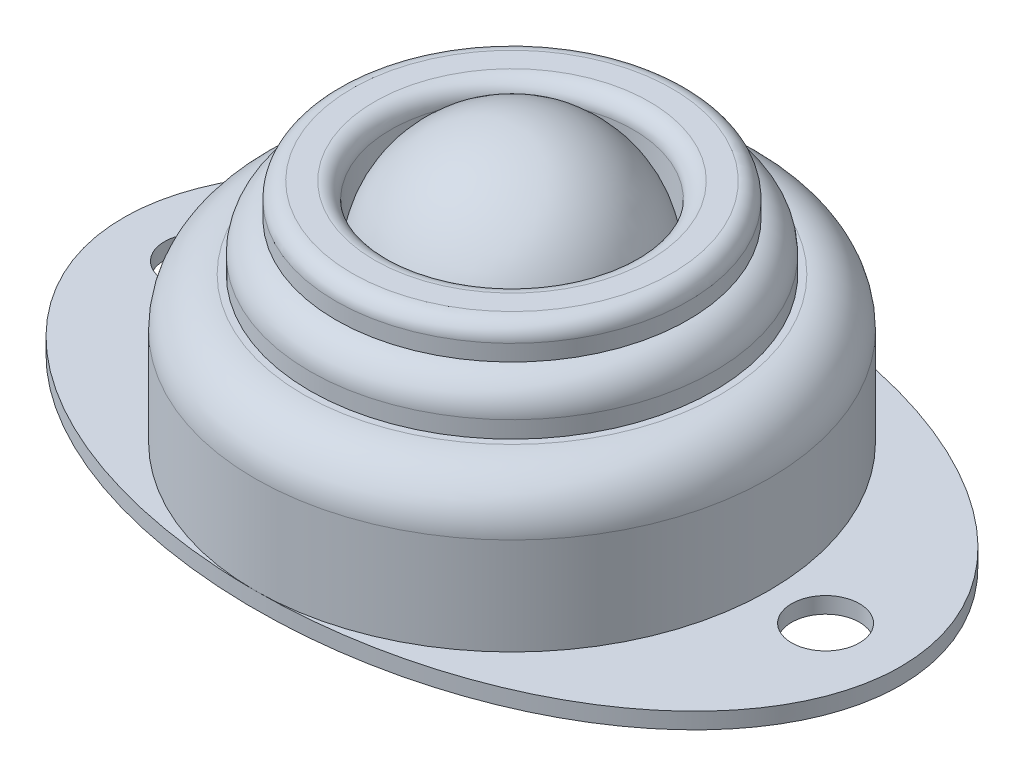
ISO-10303-21;
HEADER;
FILE_DESCRIPTION(('STEP AP214'),'2;1');
FILE_NAME('part.step','',(''),(''),'','','');
FILE_SCHEMA(('AUTOMOTIVE_DESIGN { 1 0 10303 214 1 1 1 1 }'));
ENDSEC;
DATA;
#1=APPLICATION_CONTEXT('core data for automotive mechanical design processes');
#2=APPLICATION_PROTOCOL_DEFINITION('international standard','automotive_design',2000,#1);
#3=PRODUCT_CONTEXT('',#1,'mechanical');
#4=PRODUCT('Part','Part','',(#3));
#5=PRODUCT_RELATED_PRODUCT_CATEGORY('part','',(#4));
#6=PRODUCT_DEFINITION_FORMATION('','',#4);
#7=PRODUCT_DEFINITION_CONTEXT('part definition',#1,'design');
#8=PRODUCT_DEFINITION('design','',#6,#7);
#9=PRODUCT_DEFINITION_SHAPE('','',#8);
#10=(LENGTH_UNIT() NAMED_UNIT(*) SI_UNIT(.MILLI.,.METRE.));
#11=(NAMED_UNIT(*) PLANE_ANGLE_UNIT() SI_UNIT($,.RADIAN.));
#12=(NAMED_UNIT(*) SI_UNIT($,.STERADIAN.) SOLID_ANGLE_UNIT());
#13=UNCERTAINTY_MEASURE_WITH_UNIT(LENGTH_MEASURE(1.E-05),#10,'distance_accuracy_value','');
#14=(GEOMETRIC_REPRESENTATION_CONTEXT(3) GLOBAL_UNCERTAINTY_ASSIGNED_CONTEXT((#13)) GLOBAL_UNIT_ASSIGNED_CONTEXT((#10,
#11,#12)) REPRESENTATION_CONTEXT('',''));
#15=CARTESIAN_POINT('',(0.,0.,0.));
#16=DIRECTION('',(0.,0.,1.));
#17=DIRECTION('',(1.,0.,0.));
#18=AXIS2_PLACEMENT_3D('',#15,#16,#17);
#19=CARTESIAN_POINT('',(0.,10.5,0.));
#20=DIRECTION('',(0.,1.,0.));
#21=DIRECTION('',(0.,0.,1.));
#22=AXIS2_PLACEMENT_3D('',#19,#20,#21);
#23=SPHERICAL_SURFACE('',#22,7.5);
#24=CARTESIAN_POINT('',(0.,10.5,0.));
#25=DIRECTION('',(0.,-1.,0.));
#26=DIRECTION('',(0.,0.,-1.));
#27=AXIS2_PLACEMENT_3D('',#24,#25,#26);
#28=CIRCLE('',#27,7.5);
#29=CARTESIAN_POINT('',(0.,10.5,-7.5));
#30=VERTEX_POINT('',#29);
#31=EDGE_CURVE('E11',#30,#30,#28,.T.);
#32=ORIENTED_EDGE('',*,*,#31,.F.);
#33=EDGE_LOOP('',(#32));
#34=FACE_BOUND('',#33,.T.);
#35=ADVANCED_FACE('F55',(#34),#23,.T.);
#36=CARTESIAN_POINT('',(0.,10.5,0.));
#37=DIRECTION('',(0.,1.,0.));
#38=DIRECTION('',(0.,0.,1.));
#39=AXIS2_PLACEMENT_3D('',#36,#37,#38);
#40=SPHERICAL_SURFACE('',#39,7.5);
#41=ORIENTED_EDGE('',*,*,#31,.T.);
#42=EDGE_LOOP('',(#41));
#43=FACE_BOUND('',#42,.T.);
#44=ADVANCED_FACE('F62',(#43),#40,.T.);
#45=CLOSED_SHELL('',(#35,#44));
#46=MANIFOLD_SOLID_BREP('B2',#45);
#47=CARTESIAN_POINT('',(0.,10.,0.));
#48=DIRECTION('',(0.,1.,0.));
#49=DIRECTION('',(0.,0.,1.));
#50=AXIS2_PLACEMENT_3D('',#47,#48,#49);
#51=CYLINDRICAL_SURFACE('',#50,12.5);
#52=CARTESIAN_POINT('',(0.,11.0404082057735,0.));
#53=DIRECTION('',(0.,1.,0.));
#54=DIRECTION('',(0.,0.,1.));
#55=AXIS2_PLACEMENT_3D('',#52,#53,#54);
#56=CIRCLE('',#55,12.5);
#57=CARTESIAN_POINT('',(0.,11.0404082057735,12.5));
#58=VERTEX_POINT('',#57);
#59=EDGE_CURVE('E53',#58,#58,#56,.F.);
#60=ORIENTED_EDGE('',*,*,#59,.T.);
#61=EDGE_LOOP('',(#60));
#62=FACE_BOUND('',#61,.T.);
#63=CARTESIAN_POINT('',(0.,10.,0.));
#64=DIRECTION('',(0.,1.,0.));
#65=DIRECTION('',(0.,0.,1.));
#66=AXIS2_PLACEMENT_3D('',#63,#64,#65);
#67=CIRCLE('',#66,12.5);
#68=CARTESIAN_POINT('',(0.,10.,12.5));
#69=VERTEX_POINT('',#68);
#70=EDGE_CURVE('E217',#69,#69,#67,.T.);
#71=ORIENTED_EDGE('',*,*,#70,.T.);
#72=EDGE_LOOP('',(#71));
#73=FACE_BOUND('',#72,.T.);
#74=ADVANCED_FACE('F81',(#62,#73),#51,.T.);
#75=CARTESIAN_POINT('',(0.,15.,0.));
#76=DIRECTION('',(0.,-1.,0.));
#77=DIRECTION('',(0.,0.,-1.));
#78=AXIS2_PLACEMENT_3D('',#75,#76,#77);
#79=CYLINDRICAL_SURFACE('',#78,15.9);
#80=CARTESIAN_POINT('',(0.,7.,0.));
#81=DIRECTION('',(0.,1.,0.));
#82=DIRECTION('',(0.,0.,1.));
#83=AXIS2_PLACEMENT_3D('',#80,#81,#82);
#84=CIRCLE('',#83,15.9);
#85=CARTESIAN_POINT('',(0.,7.,15.9));
#86=VERTEX_POINT('',#85);
#87=EDGE_CURVE('E89',#86,#86,#84,.F.);
#88=ORIENTED_EDGE('',*,*,#87,.T.);
#89=EDGE_LOOP('',(#88));
#90=FACE_BOUND('',#89,.T.);
#91=CARTESIAN_POINT('',(0.,1.,0.));
#92=DIRECTION('',(0.,1.,0.));
#93=DIRECTION('',(0.,0.,1.));
#94=AXIS2_PLACEMENT_3D('',#91,#92,#93);
#95=CIRCLE('',#94,15.9);
#96=CARTESIAN_POINT('',(0.,1.,15.9));
#97=VERTEX_POINT('',#96);
#98=CARTESIAN_POINT('',(0.,1.,-15.9));
#99=VERTEX_POINT('',#98);
#100=EDGE_CURVE('E95',#97,#99,#95,.F.);
#101=ORIENTED_EDGE('',*,*,#100,.F.);
#102=EDGE_CURVE('E97',#99,#97,#95,.F.);
#103=ORIENTED_EDGE('',*,*,#102,.F.);
#104=EDGE_LOOP('',(#101,#103));
#105=FACE_BOUND('',#104,.T.);
#106=ADVANCED_FACE('F98',(#90,#105),#79,.T.);
#107=CARTESIAN_POINT('',(0.,1.,0.));
#108=DIRECTION('',(0.,1.,0.));
#109=DIRECTION('',(0.,0.,1.));
#110=AXIS2_PLACEMENT_3D('',#107,#108,#109);
#111=PLANE('',#110);
#112=CARTESIAN_POINT('',(-19.4,1.,0.));
#113=DIRECTION('',(0.,1.,0.));
#114=DIRECTION('',(0.,0.,1.));
#115=AXIS2_PLACEMENT_3D('',#112,#113,#114);
#116=CIRCLE('',#115,2.1);
#117=CARTESIAN_POINT('',(-19.4,1.,2.1));
#118=VERTEX_POINT('',#117);
#119=EDGE_CURVE('E114',#118,#118,#116,.T.);
#120=ORIENTED_EDGE('',*,*,#119,.F.);
#121=EDGE_LOOP('',(#120));
#122=FACE_BOUND('',#121,.T.);
#123=CARTESIAN_POINT('',(0.,1.,0.));
#124=DIRECTION('',(0.,1.,0.));
#125=DIRECTION('',(1.,0.,0.));
#126=AXIS2_PLACEMENT_3D('',#123,#124,#125);
#127=ELLIPSE('',#126,24.05,15.9);
#128=EDGE_CURVE('E108',#99,#97,#127,.T.);
#129=ORIENTED_EDGE('',*,*,#128,.T.);
#130=ORIENTED_EDGE('',*,*,#100,.T.);
#131=EDGE_LOOP('',(#129,#130));
#132=FACE_BOUND('',#131,.T.);
#133=ADVANCED_FACE('F106',(#122,#132),#111,.T.);
#134=DIRECTION('',(0.,-1.,0.));
#135=VECTOR('',#134,1.);
#136=SURFACE_OF_LINEAR_EXTRUSION('',#127,#135);
#137=CARTESIAN_POINT('',(0.,0.,0.));
#138=DIRECTION('',(0.,1.,0.));
#139=DIRECTION('',(1.,0.,0.));
#140=AXIS2_PLACEMENT_3D('',#137,#138,#139);
#141=ELLIPSE('',#140,24.05,15.9);
#142=CARTESIAN_POINT('',(24.05,0.,0.));
#143=VERTEX_POINT('',#142);
#144=EDGE_CURVE('E188',#143,#143,#141,.T.);
#145=ORIENTED_EDGE('',*,*,#144,.T.);
#146=EDGE_LOOP('',(#145));
#147=FACE_BOUND('',#146,.T.);
#148=EDGE_CURVE('E110',#97,#99,#127,.T.);
#149=ORIENTED_EDGE('',*,*,#148,.F.);
#150=ORIENTED_EDGE('',*,*,#128,.F.);
#151=EDGE_LOOP('',(#149,#150));
#152=FACE_BOUND('',#151,.T.);
#153=ADVANCED_FACE('F116',(#147,#152),#136,.F.);
#154=CARTESIAN_POINT('',(-19.4,1.,0.));
#155=DIRECTION('',(0.,-1.,0.));
#156=DIRECTION('',(0.,0.,-1.));
#157=AXIS2_PLACEMENT_3D('',#154,#155,#156);
#158=CYLINDRICAL_SURFACE('',#157,2.1);
#159=ORIENTED_EDGE('',*,*,#119,.T.);
#160=EDGE_LOOP('',(#159));
#161=FACE_BOUND('',#160,.T.);
#162=CARTESIAN_POINT('',(-19.4,0.,0.));
#163=DIRECTION('',(0.,1.,0.));
#164=DIRECTION('',(0.,0.,1.));
#165=AXIS2_PLACEMENT_3D('',#162,#163,#164);
#166=CIRCLE('',#165,2.1);
#167=CARTESIAN_POINT('',(-19.4,0.,2.1));
#168=VERTEX_POINT('',#167);
#169=EDGE_CURVE('E109',#168,#168,#166,.T.);
#170=ORIENTED_EDGE('',*,*,#169,.F.);
#171=EDGE_LOOP('',(#170));
#172=FACE_BOUND('',#171,.T.);
#173=ADVANCED_FACE('F128',(#161,#172),#158,.F.);
#174=CARTESIAN_POINT('',(19.4,1.,0.));
#175=DIRECTION('',(0.,-1.,0.));
#176=DIRECTION('',(0.,0.,-1.));
#177=AXIS2_PLACEMENT_3D('',#174,#175,#176);
#178=CYLINDRICAL_SURFACE('',#177,2.1);
#179=CARTESIAN_POINT('',(19.4,1.,0.));
#180=DIRECTION('',(0.,1.,0.));
#181=DIRECTION('',(0.,0.,1.));
#182=AXIS2_PLACEMENT_3D('',#179,#180,#181);
#183=CIRCLE('',#182,2.1);
#184=CARTESIAN_POINT('',(19.4,1.,2.1));
#185=VERTEX_POINT('',#184);
#186=EDGE_CURVE('E117',#185,#185,#183,.F.);
#187=ORIENTED_EDGE('',*,*,#186,.F.);
#188=EDGE_LOOP('',(#187));
#189=FACE_BOUND('',#188,.T.);
#190=CARTESIAN_POINT('',(19.4,0.,0.));
#191=DIRECTION('',(0.,1.,0.));
#192=DIRECTION('',(0.,0.,1.));
#193=AXIS2_PLACEMENT_3D('',#190,#191,#192);
#194=CIRCLE('',#193,2.1);
#195=CARTESIAN_POINT('',(19.4,0.,2.1));
#196=VERTEX_POINT('',#195);
#197=EDGE_CURVE('E192',#196,#196,#194,.F.);
#198=ORIENTED_EDGE('',*,*,#197,.T.);
#199=EDGE_LOOP('',(#198));
#200=FACE_BOUND('',#199,.T.);
#201=ADVANCED_FACE('F130',(#189,#200),#178,.F.);
#202=ORIENTED_EDGE('',*,*,#148,.T.);
#203=ORIENTED_EDGE('',*,*,#102,.T.);
#204=EDGE_LOOP('',(#202,#203));
#205=FACE_BOUND('',#204,.T.);
#206=ORIENTED_EDGE('',*,*,#186,.T.);
#207=EDGE_LOOP('',(#206));
#208=FACE_BOUND('',#207,.T.);
#209=ADVANCED_FACE('F111',(#205,#208),#111,.T.);
#210=CARTESIAN_POINT('',(0.,0.,0.));
#211=DIRECTION('',(0.,1.,0.));
#212=DIRECTION('',(0.,0.,1.));
#213=AXIS2_PLACEMENT_3D('',#210,#211,#212);
#214=PLANE('',#213);
#215=ORIENTED_EDGE('',*,*,#144,.F.);
#216=EDGE_LOOP('',(#215));
#217=FACE_BOUND('',#216,.T.);
#218=ORIENTED_EDGE('',*,*,#197,.F.);
#219=EDGE_LOOP('',(#218));
#220=FACE_BOUND('',#219,.T.);
#221=ORIENTED_EDGE('',*,*,#169,.T.);
#222=EDGE_LOOP('',(#221));
#223=FACE_BOUND('',#222,.T.);
#224=ADVANCED_FACE('F167',(#217,#220,#223),#214,.F.);
#225=CARTESIAN_POINT('',(0.,10.,0.));
#226=DIRECTION('',(0.,1.,0.));
#227=DIRECTION('',(0.,0.,1.));
#228=AXIS2_PLACEMENT_3D('',#225,#226,#227);
#229=PLANE('',#228);
#230=CARTESIAN_POINT('',(0.,10.,0.));
#231=DIRECTION('',(0.,1.,0.));
#232=DIRECTION('',(0.,0.,1.));
#233=AXIS2_PLACEMENT_3D('',#230,#231,#232);
#234=CIRCLE('',#233,12.9);
#235=CARTESIAN_POINT('',(0.,10.,12.9));
#236=VERTEX_POINT('',#235);
#237=EDGE_CURVE('E210',#236,#236,#234,.T.);
#238=ORIENTED_EDGE('',*,*,#237,.T.);
#239=EDGE_LOOP('',(#238));
#240=FACE_BOUND('',#239,.T.);
#241=ORIENTED_EDGE('',*,*,#70,.F.);
#242=EDGE_LOOP('',(#241));
#243=FACE_BOUND('',#242,.T.);
#244=ADVANCED_FACE('F164',(#240,#243),#229,.T.);
#245=CARTESIAN_POINT('',(0.,13.,0.));
#246=DIRECTION('',(0.,1.,0.));
#247=DIRECTION('',(0.,0.,1.));
#248=AXIS2_PLACEMENT_3D('',#245,#246,#247);
#249=CYLINDRICAL_SURFACE('',#248,10.9);
#250=CARTESIAN_POINT('',(0.,14.,0.));
#251=DIRECTION('',(0.,1.,0.));
#252=DIRECTION('',(0.,0.,1.));
#253=AXIS2_PLACEMENT_3D('',#250,#251,#252);
#254=CIRCLE('',#253,10.9);
#255=CARTESIAN_POINT('',(0.,14.,10.9));
#256=VERTEX_POINT('',#255);
#257=EDGE_CURVE('E204',#256,#256,#254,.F.);
#258=ORIENTED_EDGE('',*,*,#257,.T.);
#259=EDGE_LOOP('',(#258));
#260=FACE_BOUND('',#259,.T.);
#261=CARTESIAN_POINT('',(0.,13.,0.));
#262=DIRECTION('',(0.,1.,0.));
#263=DIRECTION('',(0.,0.,1.));
#264=AXIS2_PLACEMENT_3D('',#261,#262,#263);
#265=CIRCLE('',#264,10.9);
#266=CARTESIAN_POINT('',(0.,13.,10.9));
#267=VERTEX_POINT('',#266);
#268=EDGE_CURVE('E218',#267,#267,#265,.T.);
#269=ORIENTED_EDGE('',*,*,#268,.T.);
#270=EDGE_LOOP('',(#269));
#271=FACE_BOUND('',#270,.T.);
#272=ADVANCED_FACE('F163',(#260,#271),#249,.T.);
#273=CARTESIAN_POINT('',(0.,3.,0.));
#274=DIRECTION('',(0.,1.,0.));
#275=DIRECTION('',(0.,0.,1.));
#276=AXIS2_PLACEMENT_3D('',#273,#274,#275);
#277=PLANE('',#276);
#278=CARTESIAN_POINT('',(0.,3.,0.));
#279=DIRECTION('',(0.,1.,0.));
#280=DIRECTION('',(0.,0.,1.));
#281=AXIS2_PLACEMENT_3D('',#278,#279,#280);
#282=CIRCLE('',#281,7.5);
#283=CARTESIAN_POINT('',(0.,3.,7.5));
#284=VERTEX_POINT('',#283);
#285=EDGE_CURVE('E102',#284,#284,#282,.T.);
#286=ORIENTED_EDGE('',*,*,#285,.T.);
#287=EDGE_LOOP('',(#286));
#288=FACE_BOUND('',#287,.T.);
#289=ADVANCED_FACE('F169',(#288),#277,.T.);
#290=CARTESIAN_POINT('',(0.,3.,0.));
#291=DIRECTION('',(0.,1.,0.));
#292=DIRECTION('',(0.,0.,1.));
#293=AXIS2_PLACEMENT_3D('',#290,#291,#292);
#294=CYLINDRICAL_SURFACE('',#293,7.5);
#295=CARTESIAN_POINT('',(0.,14.,0.));
#296=DIRECTION('',(0.,1.,0.));
#297=DIRECTION('',(0.,0.,1.));
#298=AXIS2_PLACEMENT_3D('',#295,#296,#297);
#299=CIRCLE('',#298,7.5);
#300=CARTESIAN_POINT('',(0.,14.,7.5));
#301=VERTEX_POINT('',#300);
#302=EDGE_CURVE('E207',#301,#301,#299,.T.);
#303=ORIENTED_EDGE('',*,*,#302,.T.);
#304=EDGE_LOOP('',(#303));
#305=FACE_BOUND('',#304,.T.);
#306=ORIENTED_EDGE('',*,*,#285,.F.);
#307=EDGE_LOOP('',(#306));
#308=FACE_BOUND('',#307,.T.);
#309=ADVANCED_FACE('F172',(#305,#308),#294,.F.);
#310=CARTESIAN_POINT('',(0.,15.,0.));
#311=DIRECTION('',(0.,1.,0.));
#312=DIRECTION('',(0.,0.,1.));
#313=AXIS2_PLACEMENT_3D('',#310,#311,#312);
#314=PLANE('',#313);
#315=CARTESIAN_POINT('',(0.,15.,0.));
#316=DIRECTION('',(0.,1.,0.));
#317=DIRECTION('',(0.,0.,1.));
#318=AXIS2_PLACEMENT_3D('',#315,#316,#317);
#319=CIRCLE('',#318,9.9);
#320=CARTESIAN_POINT('',(0.,15.,9.9));
#321=VERTEX_POINT('',#320);
#322=EDGE_CURVE('E201',#321,#321,#319,.T.);
#323=ORIENTED_EDGE('',*,*,#322,.T.);
#324=EDGE_LOOP('',(#323));
#325=FACE_BOUND('',#324,.T.);
#326=CARTESIAN_POINT('',(0.,15.,0.));
#327=DIRECTION('',(0.,1.,0.));
#328=DIRECTION('',(0.,0.,1.));
#329=AXIS2_PLACEMENT_3D('',#326,#327,#328);
#330=CIRCLE('',#329,8.5);
#331=CARTESIAN_POINT('',(0.,15.,8.5));
#332=VERTEX_POINT('',#331);
#333=EDGE_CURVE('E119',#332,#332,#330,.F.);
#334=ORIENTED_EDGE('',*,*,#333,.T.);
#335=EDGE_LOOP('',(#334));
#336=FACE_BOUND('',#335,.T.);
#337=ADVANCED_FACE('F139',(#325,#336),#314,.T.);
#338=CARTESIAN_POINT('',(0.,14.,0.));
#339=DIRECTION('',(0.,1.,0.));
#340=DIRECTION('',(0.,0.,1.));
#341=AXIS2_PLACEMENT_3D('',#338,#339,#340);
#342=TOROIDAL_SURFACE('',#341,9.9,1.);
#343=ORIENTED_EDGE('',*,*,#257,.F.);
#344=EDGE_LOOP('',(#343));
#345=FACE_BOUND('',#344,.T.);
#346=ORIENTED_EDGE('',*,*,#322,.F.);
#347=EDGE_LOOP('',(#346));
#348=FACE_BOUND('',#347,.T.);
#349=ADVANCED_FACE('F135',(#345,#348),#342,.T.);
#350=CARTESIAN_POINT('',(0.,14.,0.));
#351=DIRECTION('',(0.,1.,0.));
#352=DIRECTION('',(0.,0.,1.));
#353=AXIS2_PLACEMENT_3D('',#350,#351,#352);
#354=TOROIDAL_SURFACE('',#353,8.5,1.);
#355=ORIENTED_EDGE('',*,*,#333,.F.);
#356=EDGE_LOOP('',(#355));
#357=FACE_BOUND('',#356,.T.);
#358=ORIENTED_EDGE('',*,*,#302,.F.);
#359=EDGE_LOOP('',(#358));
#360=FACE_BOUND('',#359,.T.);
#361=ADVANCED_FACE('F138',(#357,#360),#354,.T.);
#362=CARTESIAN_POINT('',(0.,7.,0.));
#363=DIRECTION('',(0.,1.,0.));
#364=DIRECTION('',(0.,0.,1.));
#365=AXIS2_PLACEMENT_3D('',#362,#363,#364);
#366=TOROIDAL_SURFACE('',#365,12.9,3.);
#367=ORIENTED_EDGE('',*,*,#87,.F.);
#368=EDGE_LOOP('',(#367));
#369=FACE_BOUND('',#368,.T.);
#370=ORIENTED_EDGE('',*,*,#237,.F.);
#371=EDGE_LOOP('',(#370));
#372=FACE_BOUND('',#371,.T.);
#373=ADVANCED_FACE('F142',(#369,#372),#366,.T.);
#374=CARTESIAN_POINT('',(0.,11.0404082057735,0.));
#375=DIRECTION('',(0.,1.,0.));
#376=DIRECTION('',(0.,0.,1.));
#377=AXIS2_PLACEMENT_3D('',#374,#375,#376);
#378=TOROIDAL_SURFACE('',#377,10.5,2.);
#379=ORIENTED_EDGE('',*,*,#59,.F.);
#380=EDGE_LOOP('',(#379));
#381=FACE_BOUND('',#380,.T.);
#382=ORIENTED_EDGE('',*,*,#268,.F.);
#383=EDGE_LOOP('',(#382));
#384=FACE_BOUND('',#383,.T.);
#385=ADVANCED_FACE('F83',(#381,#384),#378,.T.);
#386=CLOSED_SHELL('',(#74,#106,#133,#153,#173,#201,#209,#224,#244,#272,#289,#309,#337,#349,#361,
#373,#385));
#387=MANIFOLD_SOLID_BREP('B6',#386);
#388=ADVANCED_BREP_SHAPE_REPRESENTATION('',(#18,#46,#387),#14);
#389=SHAPE_DEFINITION_REPRESENTATION(#9,#388);
ENDSEC;
END-ISO-10303-21;
